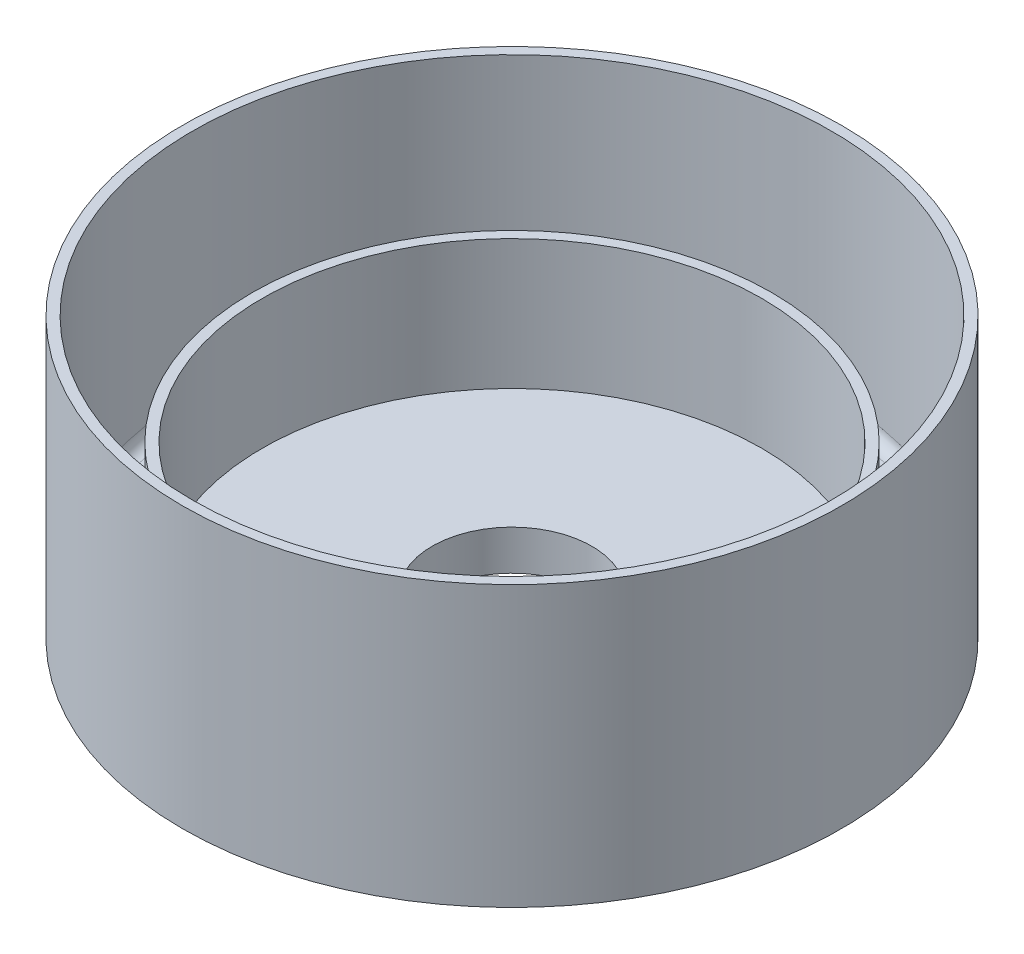
ISO-10303-21;
HEADER;
FILE_DESCRIPTION(('STEP AP214'),'2;1');
FILE_NAME('part.step','',(''),(''),'','','');
FILE_SCHEMA(('AUTOMOTIVE_DESIGN { 1 0 10303 214 1 1 1 1 }'));
ENDSEC;
DATA;
#1=APPLICATION_CONTEXT('core data for automotive mechanical design processes');
#2=APPLICATION_PROTOCOL_DEFINITION('international standard','automotive_design',2000,#1);
#3=PRODUCT_CONTEXT('',#1,'mechanical');
#4=PRODUCT('Part','Part','',(#3));
#5=PRODUCT_RELATED_PRODUCT_CATEGORY('part','',(#4));
#6=PRODUCT_DEFINITION_FORMATION('','',#4);
#7=PRODUCT_DEFINITION_CONTEXT('part definition',#1,'design');
#8=PRODUCT_DEFINITION('design','',#6,#7);
#9=PRODUCT_DEFINITION_SHAPE('','',#8);
#10=(LENGTH_UNIT() NAMED_UNIT(*) SI_UNIT(.MILLI.,.METRE.));
#11=(NAMED_UNIT(*) PLANE_ANGLE_UNIT() SI_UNIT($,.RADIAN.));
#12=(NAMED_UNIT(*) SI_UNIT($,.STERADIAN.) SOLID_ANGLE_UNIT());
#13=UNCERTAINTY_MEASURE_WITH_UNIT(LENGTH_MEASURE(1.E-05),#10,'distance_accuracy_value','');
#14=(GEOMETRIC_REPRESENTATION_CONTEXT(3) GLOBAL_UNCERTAINTY_ASSIGNED_CONTEXT((#13)) GLOBAL_UNIT_ASSIGNED_CONTEXT((#10,
#11,#12)) REPRESENTATION_CONTEXT('',''));
#15=CARTESIAN_POINT('',(0.,0.,0.));
#16=DIRECTION('',(0.,0.,1.));
#17=DIRECTION('',(1.,0.,0.));
#18=AXIS2_PLACEMENT_3D('',#15,#16,#17);
#19=CARTESIAN_POINT('',(0.,10.,0.));
#20=DIRECTION('',(0.,1.,0.));
#21=DIRECTION('',(0.,0.,1.));
#22=AXIS2_PLACEMENT_3D('',#19,#20,#21);
#23=PLANE('',#22);
#24=CARTESIAN_POINT('',(0.,10.,0.));
#25=DIRECTION('',(0.,1.,0.));
#26=DIRECTION('',(0.,0.,1.));
#27=AXIS2_PLACEMENT_3D('',#24,#25,#26);
#28=CIRCLE('',#27,20.);
#29=CARTESIAN_POINT('',(0.,10.,20.));
#30=VERTEX_POINT('',#29);
#31=EDGE_CURVE('E88',#30,#30,#28,.T.);
#32=ORIENTED_EDGE('',*,*,#31,.F.);
#33=EDGE_LOOP('',(#32));
#34=FACE_BOUND('',#33,.T.);
#35=CARTESIAN_POINT('',(0.,10.,0.));
#36=DIRECTION('',(0.,1.,0.));
#37=DIRECTION('',(0.,0.,1.));
#38=AXIS2_PLACEMENT_3D('',#35,#36,#37);
#39=CIRCLE('',#38,62.5);
#40=CARTESIAN_POINT('',(0.,10.,62.5));
#41=VERTEX_POINT('',#40);
#42=EDGE_CURVE('E83',#41,#41,#39,.F.);
#43=ORIENTED_EDGE('',*,*,#42,.F.);
#44=EDGE_LOOP('',(#43));
#45=FACE_BOUND('',#44,.T.);
#46=ADVANCED_FACE('F59',(#34,#45),#23,.T.);
#47=CARTESIAN_POINT('',(0.,10.,0.));
#48=DIRECTION('',(0.,1.,0.));
#49=DIRECTION('',(0.,0.,1.));
#50=AXIS2_PLACEMENT_3D('',#47,#48,#49);
#51=CIRCLE('',#50,68.);
#52=CARTESIAN_POINT('',(0.,10.,68.));
#53=VERTEX_POINT('',#52);
#54=EDGE_CURVE('E67',#53,#53,#51,.F.);
#55=ORIENTED_EDGE('',*,*,#54,.T.);
#56=EDGE_LOOP('',(#55));
#57=FACE_BOUND('',#56,.T.);
#58=CARTESIAN_POINT('',(0.,10.,0.));
#59=DIRECTION('',(0.,1.,0.));
#60=DIRECTION('',(0.,0.,1.));
#61=AXIS2_PLACEMENT_3D('',#58,#59,#60);
#62=CIRCLE('',#61,77.);
#63=CARTESIAN_POINT('',(0.,10.,77.));
#64=VERTEX_POINT('',#63);
#65=EDGE_CURVE('E72',#64,#64,#62,.T.);
#66=ORIENTED_EDGE('',*,*,#65,.T.);
#67=EDGE_LOOP('',(#66));
#68=FACE_BOUND('',#67,.T.);
#69=ADVANCED_FACE('F134',(#57,#68),#23,.T.);
#70=CARTESIAN_POINT('',(0.,0.,0.));
#71=DIRECTION('',(0.,1.,0.));
#72=DIRECTION('',(0.,0.,1.));
#73=AXIS2_PLACEMENT_3D('',#70,#71,#72);
#74=PLANE('',#73);
#75=CARTESIAN_POINT('',(0.,0.,0.));
#76=DIRECTION('',(0.,1.,0.));
#77=DIRECTION('',(0.,0.,1.));
#78=AXIS2_PLACEMENT_3D('',#75,#76,#77);
#79=CIRCLE('',#78,82.5);
#80=CARTESIAN_POINT('',(0.,0.,82.5));
#81=VERTEX_POINT('',#80);
#82=EDGE_CURVE('E84',#81,#81,#79,.T.);
#83=ORIENTED_EDGE('',*,*,#82,.F.);
#84=EDGE_LOOP('',(#83));
#85=FACE_BOUND('',#84,.T.);
#86=CARTESIAN_POINT('',(0.,0.,0.));
#87=DIRECTION('',(0.,1.,0.));
#88=DIRECTION('',(0.,0.,1.));
#89=AXIS2_PLACEMENT_3D('',#86,#87,#88);
#90=CIRCLE('',#89,20.);
#91=CARTESIAN_POINT('',(0.,0.,20.));
#92=VERTEX_POINT('',#91);
#93=EDGE_CURVE('E89',#92,#92,#90,.T.);
#94=ORIENTED_EDGE('',*,*,#93,.T.);
#95=EDGE_LOOP('',(#94));
#96=FACE_BOUND('',#95,.T.);
#97=ADVANCED_FACE('F140',(#85,#96),#74,.F.);
#98=CARTESIAN_POINT('',(0.,10.,0.));
#99=DIRECTION('',(0.,-1.,0.));
#100=DIRECTION('',(0.,0.,-1.));
#101=AXIS2_PLACEMENT_3D('',#98,#99,#100);
#102=CYLINDRICAL_SURFACE('',#101,82.5);
#103=ORIENTED_EDGE('',*,*,#82,.T.);
#104=EDGE_LOOP('',(#103));
#105=FACE_BOUND('',#104,.T.);
#106=CARTESIAN_POINT('',(0.,70.,0.));
#107=DIRECTION('',(0.,1.,0.));
#108=DIRECTION('',(0.,0.,1.));
#109=AXIS2_PLACEMENT_3D('',#106,#107,#108);
#110=CIRCLE('',#109,82.5);
#111=CARTESIAN_POINT('',(0.,70.,82.5));
#112=VERTEX_POINT('',#111);
#113=EDGE_CURVE('E93',#112,#112,#110,.T.);
#114=ORIENTED_EDGE('',*,*,#113,.F.);
#115=EDGE_LOOP('',(#114));
#116=FACE_BOUND('',#115,.T.);
#117=ADVANCED_FACE('F149',(#105,#116),#102,.T.);
#118=CARTESIAN_POINT('',(0.,10.,0.));
#119=DIRECTION('',(0.,-1.,0.));
#120=DIRECTION('',(0.,0.,-1.));
#121=AXIS2_PLACEMENT_3D('',#118,#119,#120);
#122=CYLINDRICAL_SURFACE('',#121,20.);
#123=ORIENTED_EDGE('',*,*,#31,.T.);
#124=EDGE_LOOP('',(#123));
#125=FACE_BOUND('',#124,.T.);
#126=ORIENTED_EDGE('',*,*,#93,.F.);
#127=EDGE_LOOP('',(#126));
#128=FACE_BOUND('',#127,.T.);
#129=ADVANCED_FACE('F145',(#125,#128),#122,.F.);
#130=CARTESIAN_POINT('',(0.,70.,0.));
#131=DIRECTION('',(0.,1.,0.));
#132=DIRECTION('',(0.,0.,1.));
#133=AXIS2_PLACEMENT_3D('',#130,#131,#132);
#134=PLANE('',#133);
#135=ORIENTED_EDGE('',*,*,#113,.T.);
#136=EDGE_LOOP('',(#135));
#137=FACE_BOUND('',#136,.T.);
#138=CARTESIAN_POINT('',(0.,70.,0.));
#139=DIRECTION('',(0.,1.,0.));
#140=DIRECTION('',(0.,0.,1.));
#141=AXIS2_PLACEMENT_3D('',#138,#139,#140);
#142=CIRCLE('',#141,80.);
#143=CARTESIAN_POINT('',(0.,70.,80.));
#144=VERTEX_POINT('',#143);
#145=EDGE_CURVE('E100',#144,#144,#142,.T.);
#146=ORIENTED_EDGE('',*,*,#145,.F.);
#147=EDGE_LOOP('',(#146));
#148=FACE_BOUND('',#147,.T.);
#149=ADVANCED_FACE('F129',(#137,#148),#134,.T.);
#150=CARTESIAN_POINT('',(0.,70.,0.));
#151=DIRECTION('',(0.,-1.,0.));
#152=DIRECTION('',(0.,0.,-1.));
#153=AXIS2_PLACEMENT_3D('',#150,#151,#152);
#154=CYLINDRICAL_SURFACE('',#153,80.);
#155=CARTESIAN_POINT('',(0.,13.,0.));
#156=DIRECTION('',(0.,1.,0.));
#157=DIRECTION('',(0.,0.,1.));
#158=AXIS2_PLACEMENT_3D('',#155,#156,#157);
#159=CIRCLE('',#158,80.);
#160=CARTESIAN_POINT('',(0.,13.,80.));
#161=VERTEX_POINT('',#160);
#162=EDGE_CURVE('E77',#161,#161,#159,.F.);
#163=ORIENTED_EDGE('',*,*,#162,.T.);
#164=EDGE_LOOP('',(#163));
#165=FACE_BOUND('',#164,.T.);
#166=ORIENTED_EDGE('',*,*,#145,.T.);
#167=EDGE_LOOP('',(#166));
#168=FACE_BOUND('',#167,.T.);
#169=ADVANCED_FACE('F121',(#165,#168),#154,.F.);
#170=CARTESIAN_POINT('',(0.,42.5,0.));
#171=DIRECTION('',(0.,1.,0.));
#172=DIRECTION('',(0.,0.,1.));
#173=AXIS2_PLACEMENT_3D('',#170,#171,#172);
#174=PLANE('',#173);
#175=CARTESIAN_POINT('',(0.,42.5,0.));
#176=DIRECTION('',(0.,1.,0.));
#177=DIRECTION('',(0.,0.,1.));
#178=AXIS2_PLACEMENT_3D('',#175,#176,#177);
#179=CIRCLE('',#178,65.);
#180=CARTESIAN_POINT('',(0.,42.5,65.));
#181=VERTEX_POINT('',#180);
#182=EDGE_CURVE('E104',#181,#181,#179,.T.);
#183=ORIENTED_EDGE('',*,*,#182,.T.);
#184=EDGE_LOOP('',(#183));
#185=FACE_BOUND('',#184,.T.);
#186=CARTESIAN_POINT('',(0.,42.5,0.));
#187=DIRECTION('',(0.,1.,0.));
#188=DIRECTION('',(0.,0.,1.));
#189=AXIS2_PLACEMENT_3D('',#186,#187,#188);
#190=CIRCLE('',#189,62.5);
#191=CARTESIAN_POINT('',(0.,42.5,62.5));
#192=VERTEX_POINT('',#191);
#193=EDGE_CURVE('E111',#192,#192,#190,.T.);
#194=ORIENTED_EDGE('',*,*,#193,.F.);
#195=EDGE_LOOP('',(#194));
#196=FACE_BOUND('',#195,.T.);
#197=ADVANCED_FACE('F118',(#185,#196),#174,.T.);
#198=CARTESIAN_POINT('',(0.,42.5,0.));
#199=DIRECTION('',(0.,-1.,0.));
#200=DIRECTION('',(0.,0.,-1.));
#201=AXIS2_PLACEMENT_3D('',#198,#199,#200);
#202=CYLINDRICAL_SURFACE('',#201,65.);
#203=CARTESIAN_POINT('',(0.,13.,0.));
#204=DIRECTION('',(0.,1.,0.));
#205=DIRECTION('',(0.,0.,1.));
#206=AXIS2_PLACEMENT_3D('',#203,#204,#205);
#207=CIRCLE('',#206,65.);
#208=CARTESIAN_POINT('',(0.,13.,65.));
#209=VERTEX_POINT('',#208);
#210=EDGE_CURVE('E11',#209,#209,#207,.T.);
#211=ORIENTED_EDGE('',*,*,#210,.T.);
#212=EDGE_LOOP('',(#211));
#213=FACE_BOUND('',#212,.T.);
#214=ORIENTED_EDGE('',*,*,#182,.F.);
#215=EDGE_LOOP('',(#214));
#216=FACE_BOUND('',#215,.T.);
#217=ADVANCED_FACE('F120',(#213,#216),#202,.T.);
#218=CARTESIAN_POINT('',(0.,42.5,0.));
#219=DIRECTION('',(0.,-1.,0.));
#220=DIRECTION('',(0.,0.,-1.));
#221=AXIS2_PLACEMENT_3D('',#218,#219,#220);
#222=CYLINDRICAL_SURFACE('',#221,62.5);
#223=ORIENTED_EDGE('',*,*,#42,.T.);
#224=EDGE_LOOP('',(#223));
#225=FACE_BOUND('',#224,.T.);
#226=ORIENTED_EDGE('',*,*,#193,.T.);
#227=EDGE_LOOP('',(#226));
#228=FACE_BOUND('',#227,.T.);
#229=ADVANCED_FACE('F116',(#225,#228),#222,.F.);
#230=CARTESIAN_POINT('',(0.,13.,0.));
#231=DIRECTION('',(0.,1.,0.));
#232=DIRECTION('',(0.,0.,1.));
#233=AXIS2_PLACEMENT_3D('',#230,#231,#232);
#234=TOROIDAL_SURFACE('',#233,77.,3.);
#235=ORIENTED_EDGE('',*,*,#65,.F.);
#236=EDGE_LOOP('',(#235));
#237=FACE_BOUND('',#236,.T.);
#238=ORIENTED_EDGE('',*,*,#162,.F.);
#239=EDGE_LOOP('',(#238));
#240=FACE_BOUND('',#239,.T.);
#241=ADVANCED_FACE('F153',(#237,#240),#234,.F.);
#242=CARTESIAN_POINT('',(0.,13.,0.));
#243=DIRECTION('',(0.,1.,0.));
#244=DIRECTION('',(0.,0.,1.));
#245=AXIS2_PLACEMENT_3D('',#242,#243,#244);
#246=TOROIDAL_SURFACE('',#245,68.,3.);
#247=ORIENTED_EDGE('',*,*,#210,.F.);
#248=EDGE_LOOP('',(#247));
#249=FACE_BOUND('',#248,.T.);
#250=ORIENTED_EDGE('',*,*,#54,.F.);
#251=EDGE_LOOP('',(#250));
#252=FACE_BOUND('',#251,.T.);
#253=ADVANCED_FACE('F61',(#249,#252),#246,.F.);
#254=CLOSED_SHELL('',(#46,#69,#97,#117,#129,#149,#169,#197,#217,#229,#241,#253));
#255=MANIFOLD_SOLID_BREP('B2',#254);
#256=ADVANCED_BREP_SHAPE_REPRESENTATION('',(#18,#255),#14);
#257=SHAPE_DEFINITION_REPRESENTATION(#9,#256);
ENDSEC;
END-ISO-10303-21;
